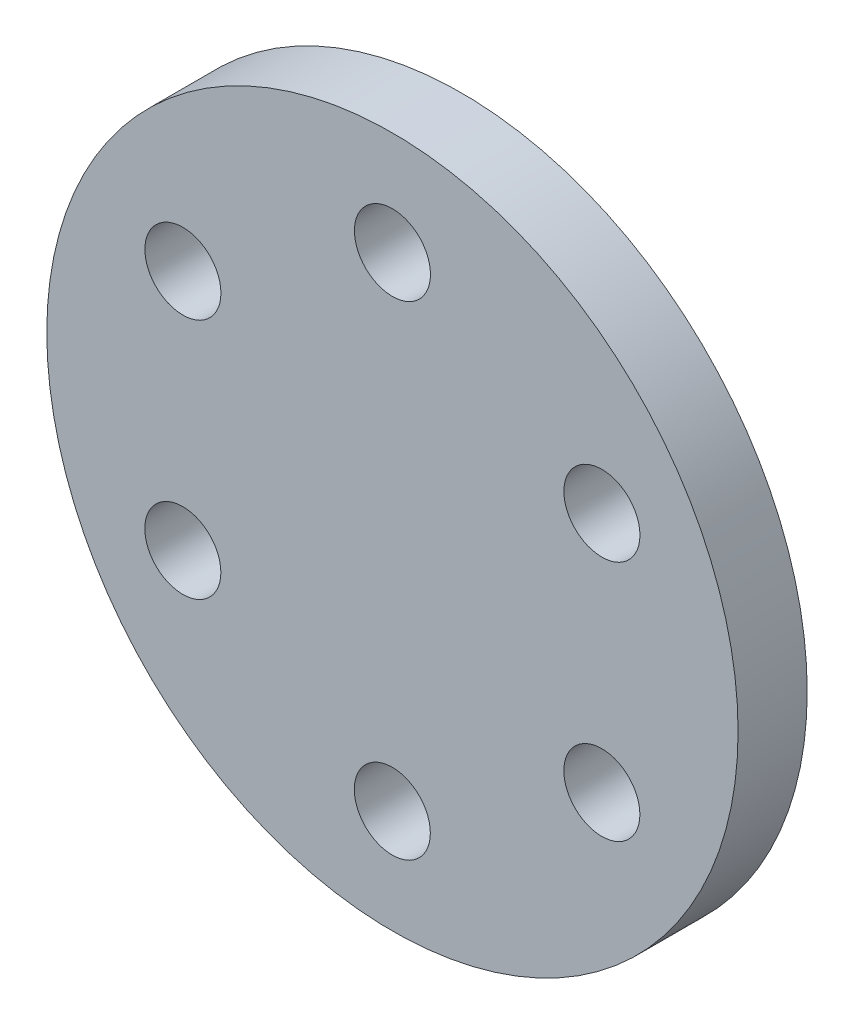
ISO-10303-21;
HEADER;
FILE_DESCRIPTION(('STEP AP214'),'2;1');
FILE_NAME('part.step','',(''),(''),'','','');
FILE_SCHEMA(('AUTOMOTIVE_DESIGN { 1 0 10303 214 1 1 1 1 }'));
ENDSEC;
DATA;
#1=APPLICATION_CONTEXT('core data for automotive mechanical design processes');
#2=APPLICATION_PROTOCOL_DEFINITION('international standard','automotive_design',2000,#1);
#3=PRODUCT_CONTEXT('',#1,'mechanical');
#4=PRODUCT('Part','Part','',(#3));
#5=PRODUCT_RELATED_PRODUCT_CATEGORY('part','',(#4));
#6=PRODUCT_DEFINITION_FORMATION('','',#4);
#7=PRODUCT_DEFINITION_CONTEXT('part definition',#1,'design');
#8=PRODUCT_DEFINITION('design','',#6,#7);
#9=PRODUCT_DEFINITION_SHAPE('','',#8);
#10=(LENGTH_UNIT() NAMED_UNIT(*) SI_UNIT(.MILLI.,.METRE.));
#11=(NAMED_UNIT(*) PLANE_ANGLE_UNIT() SI_UNIT($,.RADIAN.));
#12=(NAMED_UNIT(*) SI_UNIT($,.STERADIAN.) SOLID_ANGLE_UNIT());
#13=UNCERTAINTY_MEASURE_WITH_UNIT(LENGTH_MEASURE(1.E-05),#10,'distance_accuracy_value','');
#14=(GEOMETRIC_REPRESENTATION_CONTEXT(3) GLOBAL_UNCERTAINTY_ASSIGNED_CONTEXT((#13)) GLOBAL_UNIT_ASSIGNED_CONTEXT((#10,
#11,#12)) REPRESENTATION_CONTEXT('',''));
#15=CARTESIAN_POINT('',(0.,0.,0.));
#16=DIRECTION('',(0.,0.,1.));
#17=DIRECTION('',(1.,0.,0.));
#18=AXIS2_PLACEMENT_3D('',#15,#16,#17);
#19=CARTESIAN_POINT('',(0.,0.,10.));
#20=DIRECTION('',(0.,0.,-1.));
#21=DIRECTION('',(-1.,0.,0.));
#22=AXIS2_PLACEMENT_3D('',#19,#20,#21);
#23=CYLINDRICAL_SURFACE('',#22,50.);
#24=CARTESIAN_POINT('',(0.,0.,10.));
#25=DIRECTION('',(0.,0.,1.));
#26=DIRECTION('',(1.,0.,0.));
#27=AXIS2_PLACEMENT_3D('',#24,#25,#26);
#28=CIRCLE('',#27,50.);
#29=CARTESIAN_POINT('',(50.,0.,10.));
#30=VERTEX_POINT('',#29);
#31=EDGE_CURVE('E10',#30,#30,#28,.T.);
#32=ORIENTED_EDGE('',*,*,#31,.F.);
#33=EDGE_LOOP('',(#32));
#34=FACE_BOUND('',#33,.T.);
#35=CARTESIAN_POINT('',(0.,0.,0.));
#36=DIRECTION('',(0.,0.,1.));
#37=DIRECTION('',(1.,0.,0.));
#38=AXIS2_PLACEMENT_3D('',#35,#36,#37);
#39=CIRCLE('',#38,50.);
#40=CARTESIAN_POINT('',(50.,0.,0.));
#41=VERTEX_POINT('',#40);
#42=EDGE_CURVE('E46',#41,#41,#39,.T.);
#43=ORIENTED_EDGE('',*,*,#42,.T.);
#44=EDGE_LOOP('',(#43));
#45=FACE_BOUND('',#44,.T.);
#46=ADVANCED_FACE('F43',(#34,#45),#23,.T.);
#47=CARTESIAN_POINT('',(0.,0.,10.));
#48=DIRECTION('',(0.,0.,1.));
#49=DIRECTION('',(1.,0.,0.));
#50=AXIS2_PLACEMENT_3D('',#47,#48,#49);
#51=PLANE('',#50);
#52=CARTESIAN_POINT('',(0.,35.,10.));
#53=DIRECTION('',(0.,0.,1.));
#54=DIRECTION('',(1.,0.,0.));
#55=AXIS2_PLACEMENT_3D('',#52,#53,#54);
#56=CIRCLE('',#55,5.5);
#57=CARTESIAN_POINT('',(5.5,35.,10.));
#58=VERTEX_POINT('',#57);
#59=EDGE_CURVE('E90',#58,#58,#56,.T.);
#60=ORIENTED_EDGE('',*,*,#59,.F.);
#61=EDGE_LOOP('',(#60));
#62=FACE_BOUND('',#61,.T.);
#63=CARTESIAN_POINT('',(-30.3108891324554,17.5101720517305,10.));
#64=DIRECTION('',(0.,0.,1.));
#65=DIRECTION('',(1.,0.,0.));
#66=AXIS2_PLACEMENT_3D('',#63,#64,#65);
#67=CIRCLE('',#66,5.5);
#68=CARTESIAN_POINT('',(-24.8108891324554,17.5101720517305,10.));
#69=VERTEX_POINT('',#68);
#70=EDGE_CURVE('E62',#69,#69,#67,.T.);
#71=ORIENTED_EDGE('',*,*,#70,.F.);
#72=EDGE_LOOP('',(#71));
#73=FACE_BOUND('',#72,.T.);
#74=CARTESIAN_POINT('',(-30.3196983876627,-17.4847419224044,10.));
#75=DIRECTION('',(0.,0.,1.));
#76=DIRECTION('',(1.,0.,0.));
#77=AXIS2_PLACEMENT_3D('',#74,#75,#76);
#78=CIRCLE('',#77,5.5);
#79=CARTESIAN_POINT('',(-24.8196983876627,-17.4847419224044,10.));
#80=VERTEX_POINT('',#79);
#81=EDGE_CURVE('E61',#80,#80,#78,.T.);
#82=ORIENTED_EDGE('',*,*,#81,.F.);
#83=EDGE_LOOP('',(#82));
#84=FACE_BOUND('',#83,.T.);
#85=CARTESIAN_POINT('',(-0.0176185104144518,-34.9898279482697,10.));
#86=DIRECTION('',(0.,0.,1.));
#87=DIRECTION('',(1.,0.,0.));
#88=AXIS2_PLACEMENT_3D('',#85,#86,#87);
#89=CIRCLE('',#88,5.5);
#90=CARTESIAN_POINT('',(5.48238148958555,-34.9898279482697,10.));
#91=VERTEX_POINT('',#90);
#92=EDGE_CURVE('E70',#91,#91,#89,.T.);
#93=ORIENTED_EDGE('',*,*,#92,.F.);
#94=EDGE_LOOP('',(#93));
#95=FACE_BOUND('',#94,.T.);
#96=CARTESIAN_POINT('',(30.293270622041,-17.5000000000001,10.));
#97=DIRECTION('',(0.,0.,1.));
#98=DIRECTION('',(1.,0.,0.));
#99=AXIS2_PLACEMENT_3D('',#96,#97,#98);
#100=CIRCLE('',#99,5.5);
#101=CARTESIAN_POINT('',(35.793270622041,-17.5000000000001,10.));
#102=VERTEX_POINT('',#101);
#103=EDGE_CURVE('E78',#102,#102,#100,.T.);
#104=ORIENTED_EDGE('',*,*,#103,.F.);
#105=EDGE_LOOP('',(#104));
#106=FACE_BOUND('',#105,.T.);
#107=CARTESIAN_POINT('',(30.3020798772482,17.4949139741347,10.));
#108=DIRECTION('',(0.,0.,1.));
#109=DIRECTION('',(1.,0.,0.));
#110=AXIS2_PLACEMENT_3D('',#107,#108,#109);
#111=CIRCLE('',#110,5.5);
#112=CARTESIAN_POINT('',(35.8020798772482,17.4949139741347,10.));
#113=VERTEX_POINT('',#112);
#114=EDGE_CURVE('E86',#113,#113,#111,.T.);
#115=ORIENTED_EDGE('',*,*,#114,.F.);
#116=EDGE_LOOP('',(#115));
#117=FACE_BOUND('',#116,.T.);
#118=ORIENTED_EDGE('',*,*,#31,.T.);
#119=EDGE_LOOP('',(#118));
#120=FACE_BOUND('',#119,.T.);
#121=ADVANCED_FACE('F115',(#62,#73,#84,#95,#106,#117,#120),#51,.T.);
#122=CARTESIAN_POINT('',(0.,0.,0.));
#123=DIRECTION('',(0.,0.,1.));
#124=DIRECTION('',(1.,0.,0.));
#125=AXIS2_PLACEMENT_3D('',#122,#123,#124);
#126=PLANE('',#125);
#127=CARTESIAN_POINT('',(0.,35.,0.));
#128=DIRECTION('',(0.,0.,1.));
#129=DIRECTION('',(1.,0.,0.));
#130=AXIS2_PLACEMENT_3D('',#127,#128,#129);
#131=CIRCLE('',#130,5.5);
#132=CARTESIAN_POINT('',(5.5,35.,0.));
#133=VERTEX_POINT('',#132);
#134=EDGE_CURVE('E55',#133,#133,#131,.T.);
#135=ORIENTED_EDGE('',*,*,#134,.T.);
#136=EDGE_LOOP('',(#135));
#137=FACE_BOUND('',#136,.T.);
#138=CARTESIAN_POINT('',(-30.3108891324554,17.5101720517305,0.));
#139=DIRECTION('',(0.,0.,1.));
#140=DIRECTION('',(1.,0.,0.));
#141=AXIS2_PLACEMENT_3D('',#138,#139,#140);
#142=CIRCLE('',#141,5.5);
#143=CARTESIAN_POINT('',(-24.8108891324554,17.5101720517305,0.));
#144=VERTEX_POINT('',#143);
#145=EDGE_CURVE('E91',#144,#144,#142,.T.);
#146=ORIENTED_EDGE('',*,*,#145,.T.);
#147=EDGE_LOOP('',(#146));
#148=FACE_BOUND('',#147,.T.);
#149=CARTESIAN_POINT('',(-30.3196983876627,-17.4847419224044,0.));
#150=DIRECTION('',(0.,0.,1.));
#151=DIRECTION('',(1.,0.,0.));
#152=AXIS2_PLACEMENT_3D('',#149,#150,#151);
#153=CIRCLE('',#152,5.5);
#154=CARTESIAN_POINT('',(-24.8196983876627,-17.4847419224044,0.));
#155=VERTEX_POINT('',#154);
#156=EDGE_CURVE('E57',#155,#155,#153,.T.);
#157=ORIENTED_EDGE('',*,*,#156,.T.);
#158=EDGE_LOOP('',(#157));
#159=FACE_BOUND('',#158,.T.);
#160=CARTESIAN_POINT('',(-0.0176185104144518,-34.9898279482697,0.));
#161=DIRECTION('',(0.,0.,1.));
#162=DIRECTION('',(1.,0.,0.));
#163=AXIS2_PLACEMENT_3D('',#160,#161,#162);
#164=CIRCLE('',#163,5.5);
#165=CARTESIAN_POINT('',(5.48238148958555,-34.9898279482697,0.));
#166=VERTEX_POINT('',#165);
#167=EDGE_CURVE('E66',#166,#166,#164,.T.);
#168=ORIENTED_EDGE('',*,*,#167,.T.);
#169=EDGE_LOOP('',(#168));
#170=FACE_BOUND('',#169,.T.);
#171=CARTESIAN_POINT('',(30.293270622041,-17.5000000000001,0.));
#172=DIRECTION('',(0.,0.,1.));
#173=DIRECTION('',(1.,0.,0.));
#174=AXIS2_PLACEMENT_3D('',#171,#172,#173);
#175=CIRCLE('',#174,5.5);
#176=CARTESIAN_POINT('',(35.793270622041,-17.5000000000001,0.));
#177=VERTEX_POINT('',#176);
#178=EDGE_CURVE('E74',#177,#177,#175,.T.);
#179=ORIENTED_EDGE('',*,*,#178,.T.);
#180=EDGE_LOOP('',(#179));
#181=FACE_BOUND('',#180,.T.);
#182=CARTESIAN_POINT('',(30.3020798772482,17.4949139741347,0.));
#183=DIRECTION('',(0.,0.,1.));
#184=DIRECTION('',(1.,0.,0.));
#185=AXIS2_PLACEMENT_3D('',#182,#183,#184);
#186=CIRCLE('',#185,5.5);
#187=CARTESIAN_POINT('',(35.8020798772482,17.4949139741347,0.));
#188=VERTEX_POINT('',#187);
#189=EDGE_CURVE('E82',#188,#188,#186,.T.);
#190=ORIENTED_EDGE('',*,*,#189,.T.);
#191=EDGE_LOOP('',(#190));
#192=FACE_BOUND('',#191,.T.);
#193=ORIENTED_EDGE('',*,*,#42,.F.);
#194=EDGE_LOOP('',(#193));
#195=FACE_BOUND('',#194,.T.);
#196=ADVANCED_FACE('F105',(#137,#148,#159,#170,#181,#192,#195),#126,.F.);
#197=CARTESIAN_POINT('',(30.3020798772482,17.4949139741347,0.));
#198=DIRECTION('',(0.,0.,1.));
#199=DIRECTION('',(1.,0.,0.));
#200=AXIS2_PLACEMENT_3D('',#197,#198,#199);
#201=CYLINDRICAL_SURFACE('',#200,5.5);
#202=ORIENTED_EDGE('',*,*,#189,.F.);
#203=EDGE_LOOP('',(#202));
#204=FACE_BOUND('',#203,.T.);
#205=ORIENTED_EDGE('',*,*,#114,.T.);
#206=EDGE_LOOP('',(#205));
#207=FACE_BOUND('',#206,.T.);
#208=ADVANCED_FACE('F129',(#204,#207),#201,.F.);
#209=CARTESIAN_POINT('',(30.293270622041,-17.5000000000001,0.));
#210=DIRECTION('',(0.,0.,1.));
#211=DIRECTION('',(1.,0.,0.));
#212=AXIS2_PLACEMENT_3D('',#209,#210,#211);
#213=CYLINDRICAL_SURFACE('',#212,5.5);
#214=ORIENTED_EDGE('',*,*,#178,.F.);
#215=EDGE_LOOP('',(#214));
#216=FACE_BOUND('',#215,.T.);
#217=ORIENTED_EDGE('',*,*,#103,.T.);
#218=EDGE_LOOP('',(#217));
#219=FACE_BOUND('',#218,.T.);
#220=ADVANCED_FACE('F131',(#216,#219),#213,.F.);
#221=CARTESIAN_POINT('',(-0.0176185104144518,-34.9898279482697,0.));
#222=DIRECTION('',(0.,0.,1.));
#223=DIRECTION('',(1.,0.,0.));
#224=AXIS2_PLACEMENT_3D('',#221,#222,#223);
#225=CYLINDRICAL_SURFACE('',#224,5.5);
#226=ORIENTED_EDGE('',*,*,#167,.F.);
#227=EDGE_LOOP('',(#226));
#228=FACE_BOUND('',#227,.T.);
#229=ORIENTED_EDGE('',*,*,#92,.T.);
#230=EDGE_LOOP('',(#229));
#231=FACE_BOUND('',#230,.T.);
#232=ADVANCED_FACE('F138',(#228,#231),#225,.F.);
#233=CARTESIAN_POINT('',(-30.3196983876627,-17.4847419224044,0.));
#234=DIRECTION('',(0.,0.,1.));
#235=DIRECTION('',(1.,0.,0.));
#236=AXIS2_PLACEMENT_3D('',#233,#234,#235);
#237=CYLINDRICAL_SURFACE('',#236,5.5);
#238=ORIENTED_EDGE('',*,*,#156,.F.);
#239=EDGE_LOOP('',(#238));
#240=FACE_BOUND('',#239,.T.);
#241=ORIENTED_EDGE('',*,*,#81,.T.);
#242=EDGE_LOOP('',(#241));
#243=FACE_BOUND('',#242,.T.);
#244=ADVANCED_FACE('F180',(#240,#243),#237,.F.);
#245=CARTESIAN_POINT('',(-30.3108891324554,17.5101720517305,0.));
#246=DIRECTION('',(0.,0.,1.));
#247=DIRECTION('',(1.,0.,0.));
#248=AXIS2_PLACEMENT_3D('',#245,#246,#247);
#249=CYLINDRICAL_SURFACE('',#248,5.5);
#250=ORIENTED_EDGE('',*,*,#145,.F.);
#251=EDGE_LOOP('',(#250));
#252=FACE_BOUND('',#251,.T.);
#253=ORIENTED_EDGE('',*,*,#70,.T.);
#254=EDGE_LOOP('',(#253));
#255=FACE_BOUND('',#254,.T.);
#256=ADVANCED_FACE('F111',(#252,#255),#249,.F.);
#257=CARTESIAN_POINT('',(0.,35.,0.));
#258=DIRECTION('',(0.,0.,1.));
#259=DIRECTION('',(1.,0.,0.));
#260=AXIS2_PLACEMENT_3D('',#257,#258,#259);
#261=CYLINDRICAL_SURFACE('',#260,5.5);
#262=ORIENTED_EDGE('',*,*,#134,.F.);
#263=EDGE_LOOP('',(#262));
#264=FACE_BOUND('',#263,.T.);
#265=ORIENTED_EDGE('',*,*,#59,.T.);
#266=EDGE_LOOP('',(#265));
#267=FACE_BOUND('',#266,.T.);
#268=ADVANCED_FACE('F108',(#264,#267),#261,.F.);
#269=CLOSED_SHELL('',(#46,#121,#196,#208,#220,#232,#244,#256,#268));
#270=MANIFOLD_SOLID_BREP('B2',#269);
#271=ADVANCED_BREP_SHAPE_REPRESENTATION('',(#18,#270),#14);
#272=SHAPE_DEFINITION_REPRESENTATION(#9,#271);
ENDSEC;
END-ISO-10303-21;
